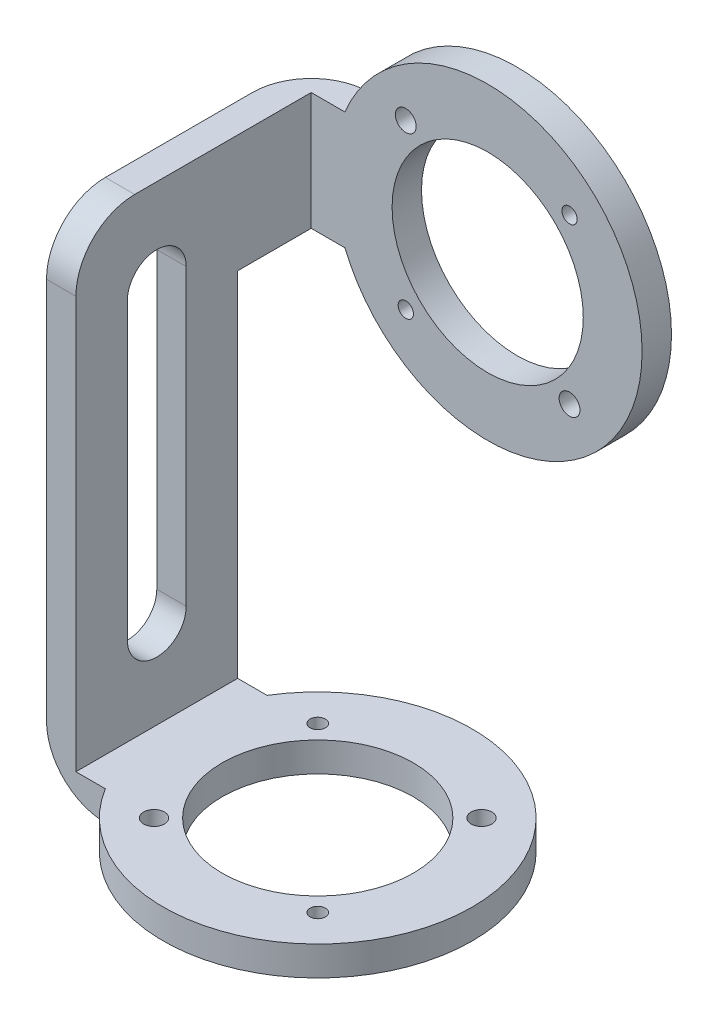
ISO-10303-21;
HEADER;
FILE_DESCRIPTION(('STEP AP214'),'2;1');
FILE_NAME('part.step','',(''),(''),'','','');
FILE_SCHEMA(('AUTOMOTIVE_DESIGN { 1 0 10303 214 1 1 1 1 }'));
ENDSEC;
DATA;
#1=APPLICATION_CONTEXT('core data for automotive mechanical design processes');
#2=APPLICATION_PROTOCOL_DEFINITION('international standard','automotive_design',2000,#1);
#3=PRODUCT_CONTEXT('',#1,'mechanical');
#4=PRODUCT('Part','Part','',(#3));
#5=PRODUCT_RELATED_PRODUCT_CATEGORY('part','',(#4));
#6=PRODUCT_DEFINITION_FORMATION('','',#4);
#7=PRODUCT_DEFINITION_CONTEXT('part definition',#1,'design');
#8=PRODUCT_DEFINITION('design','',#6,#7);
#9=PRODUCT_DEFINITION_SHAPE('','',#8);
#10=(LENGTH_UNIT() NAMED_UNIT(*) SI_UNIT(.MILLI.,.METRE.));
#11=(NAMED_UNIT(*) PLANE_ANGLE_UNIT() SI_UNIT($,.RADIAN.));
#12=(NAMED_UNIT(*) SI_UNIT($,.STERADIAN.) SOLID_ANGLE_UNIT());
#13=UNCERTAINTY_MEASURE_WITH_UNIT(LENGTH_MEASURE(1.E-05),#10,'distance_accuracy_value','');
#14=(GEOMETRIC_REPRESENTATION_CONTEXT(3) GLOBAL_UNCERTAINTY_ASSIGNED_CONTEXT((#13)) GLOBAL_UNIT_ASSIGNED_CONTEXT((#10,
#11,#12)) REPRESENTATION_CONTEXT('',''));
#15=CARTESIAN_POINT('',(0.,0.,0.));
#16=DIRECTION('',(0.,0.,1.));
#17=DIRECTION('',(1.,0.,0.));
#18=AXIS2_PLACEMENT_3D('',#15,#16,#17);
#19=CARTESIAN_POINT('',(0.,0.,6.35));
#20=DIRECTION('',(0.,0.,-1.));
#21=DIRECTION('',(-1.,0.,0.));
#22=AXIS2_PLACEMENT_3D('',#19,#20,#21);
#23=CYLINDRICAL_SURFACE('',#22,33.3375);
#24=CARTESIAN_POINT('',(0.,0.,0.));
#25=DIRECTION('',(0.,0.,1.));
#26=DIRECTION('',(1.,0.,0.));
#27=AXIS2_PLACEMENT_3D('',#24,#25,#26);
#28=CIRCLE('',#27,33.3375);
#29=CARTESIAN_POINT('',(-30.8236744443293,-12.7,0.));
#30=VERTEX_POINT('',#29);
#31=CARTESIAN_POINT('',(-30.8236744443293,12.7,0.));
#32=VERTEX_POINT('',#31);
#33=EDGE_CURVE('E419',#30,#32,#28,.T.);
#34=ORIENTED_EDGE('',*,*,#33,.T.);
#35=DIRECTION('',(0.,0.,-1.));
#36=VECTOR('',#35,1.);
#37=CARTESIAN_POINT('',(-30.8236744443293,12.7,6.35));
#38=LINE('',#37,#36);
#39=CARTESIAN_POINT('',(-30.8236744443293,12.7,6.35));
#40=VERTEX_POINT('',#39);
#41=EDGE_CURVE('E432',#40,#32,#38,.T.);
#42=ORIENTED_EDGE('',*,*,#41,.F.);
#43=CARTESIAN_POINT('',(0.,0.,6.35));
#44=DIRECTION('',(0.,0.,1.));
#45=DIRECTION('',(1.,0.,0.));
#46=AXIS2_PLACEMENT_3D('',#43,#44,#45);
#47=CIRCLE('',#46,33.3375);
#48=CARTESIAN_POINT('',(-30.8236744443293,-12.7,6.35));
#49=VERTEX_POINT('',#48);
#50=EDGE_CURVE('E384',#49,#40,#47,.T.);
#51=ORIENTED_EDGE('',*,*,#50,.F.);
#52=DIRECTION('',(0.,0.,-1.));
#53=VECTOR('',#52,1.);
#54=CARTESIAN_POINT('',(-30.8236744443293,-12.7,6.35));
#55=LINE('',#54,#53);
#56=EDGE_CURVE('E399',#49,#30,#55,.T.);
#57=ORIENTED_EDGE('',*,*,#56,.T.);
#58=EDGE_LOOP('',(#34,#42,#51,#57));
#59=FACE_BOUND('',#58,.T.);
#60=ADVANCED_FACE('F130',(#59),#23,.T.);
#61=CARTESIAN_POINT('',(0.,12.7,6.35));
#62=DIRECTION('',(0.,-1.,0.));
#63=DIRECTION('',(1.,0.,0.));
#64=AXIS2_PLACEMENT_3D('',#61,#62,#63);
#65=PLANE('',#64);
#66=DIRECTION('',(0.,0.,1.));
#67=VECTOR('',#66,1.);
#68=CARTESIAN_POINT('',(-44.45,12.7,0.));
#69=LINE('',#68,#67);
#70=CARTESIAN_POINT('',(-44.45,12.7,12.7));
#71=VERTEX_POINT('',#70);
#72=CARTESIAN_POINT('',(-44.45,12.7,44.45));
#73=VERTEX_POINT('',#72);
#74=EDGE_CURVE('E333',#71,#73,#69,.T.);
#75=ORIENTED_EDGE('',*,*,#74,.T.);
#76=DIRECTION('',(1.,0.,0.));
#77=VECTOR('',#76,1.);
#78=CARTESIAN_POINT('',(-38.1,12.7,44.45));
#79=LINE('',#78,#77);
#80=CARTESIAN_POINT('',(-38.1,12.7,44.45));
#81=VERTEX_POINT('',#80);
#82=EDGE_CURVE('E453',#73,#81,#79,.T.);
#83=ORIENTED_EDGE('',*,*,#82,.T.);
#84=DIRECTION('',(0.,0.,1.));
#85=VECTOR('',#84,1.);
#86=CARTESIAN_POINT('',(-38.1,12.7,0.));
#87=LINE('',#86,#85);
#88=CARTESIAN_POINT('',(-38.1,12.7,6.35));
#89=VERTEX_POINT('',#88);
#90=EDGE_CURVE('E347',#89,#81,#87,.T.);
#91=ORIENTED_EDGE('',*,*,#90,.F.);
#92=DIRECTION('',(-1.,0.,0.));
#93=VECTOR('',#92,1.);
#94=CARTESIAN_POINT('',(0.,12.7,6.35));
#95=LINE('',#94,#93);
#96=EDGE_CURVE('E388',#40,#89,#95,.T.);
#97=ORIENTED_EDGE('',*,*,#96,.F.);
#98=ORIENTED_EDGE('',*,*,#41,.T.);
#99=DIRECTION('',(-1.,0.,0.));
#100=VECTOR('',#99,1.);
#101=CARTESIAN_POINT('',(0.,12.7,0.));
#102=LINE('',#101,#100);
#103=CARTESIAN_POINT('',(-31.75,12.7,0.));
#104=VERTEX_POINT('',#103);
#105=EDGE_CURVE('E423',#32,#104,#102,.T.);
#106=ORIENTED_EDGE('',*,*,#105,.T.);
#107=CARTESIAN_POINT('',(-31.75,12.7,12.7));
#108=DIRECTION('',(0.,-1.,0.));
#109=DIRECTION('',(1.,0.,0.));
#110=AXIS2_PLACEMENT_3D('',#107,#108,#109);
#111=CIRCLE('',#110,12.7);
#112=EDGE_CURVE('E440',#104,#71,#111,.F.);
#113=ORIENTED_EDGE('',*,*,#112,.T.);
#114=EDGE_LOOP('',(#75,#83,#91,#97,#98,#106,#113));
#115=FACE_BOUND('',#114,.T.);
#116=ADVANCED_FACE('F462',(#115),#65,.F.);
#117=CARTESIAN_POINT('',(0.,0.,6.35));
#118=DIRECTION('',(0.,0.,-1.));
#119=DIRECTION('',(-1.,0.,0.));
#120=AXIS2_PLACEMENT_3D('',#117,#118,#119);
#121=CYLINDRICAL_SURFACE('',#120,20.6375);
#122=CARTESIAN_POINT('',(0.,0.,6.35));
#123=DIRECTION('',(0.,0.,1.));
#124=DIRECTION('',(1.,0.,0.));
#125=AXIS2_PLACEMENT_3D('',#122,#123,#124);
#126=CIRCLE('',#125,20.6375);
#127=CARTESIAN_POINT('',(20.6375,0.,6.35));
#128=VERTEX_POINT('',#127);
#129=EDGE_CURVE('E380',#128,#128,#126,.T.);
#130=ORIENTED_EDGE('',*,*,#129,.T.);
#131=EDGE_LOOP('',(#130));
#132=FACE_BOUND('',#131,.T.);
#133=CARTESIAN_POINT('',(0.,0.,0.));
#134=DIRECTION('',(0.,0.,1.));
#135=DIRECTION('',(1.,0.,0.));
#136=AXIS2_PLACEMENT_3D('',#133,#134,#135);
#137=CIRCLE('',#136,20.6375);
#138=CARTESIAN_POINT('',(20.6375,0.,0.));
#139=VERTEX_POINT('',#138);
#140=EDGE_CURVE('E415',#139,#139,#137,.T.);
#141=ORIENTED_EDGE('',*,*,#140,.F.);
#142=EDGE_LOOP('',(#141));
#143=FACE_BOUND('',#142,.T.);
#144=ADVANCED_FACE('F549',(#132,#143),#121,.F.);
#145=CARTESIAN_POINT('',(-17.6776695296635,-17.6776695296638,6.35));
#146=DIRECTION('',(0.,0.,-1.));
#147=DIRECTION('',(-1.,0.,0.));
#148=AXIS2_PLACEMENT_3D('',#145,#146,#147);
#149=CYLINDRICAL_SURFACE('',#148,1.64999999999998);
#150=CARTESIAN_POINT('',(-17.6776695296635,-17.6776695296638,6.35));
#151=DIRECTION('',(0.,0.,1.));
#152=DIRECTION('',(1.,0.,0.));
#153=AXIS2_PLACEMENT_3D('',#150,#151,#152);
#154=CIRCLE('',#153,1.64999999999998);
#155=CARTESIAN_POINT('',(-16.0276695296635,-17.6776695296638,6.35));
#156=VERTEX_POINT('',#155);
#157=EDGE_CURVE('E376',#156,#156,#154,.T.);
#158=ORIENTED_EDGE('',*,*,#157,.T.);
#159=EDGE_LOOP('',(#158));
#160=FACE_BOUND('',#159,.T.);
#161=CARTESIAN_POINT('',(-17.6776695296635,-17.6776695296638,0.));
#162=DIRECTION('',(0.,0.,1.));
#163=DIRECTION('',(1.,0.,0.));
#164=AXIS2_PLACEMENT_3D('',#161,#162,#163);
#165=CIRCLE('',#164,1.64999999999998);
#166=CARTESIAN_POINT('',(-16.0276695296635,-17.6776695296638,0.));
#167=VERTEX_POINT('',#166);
#168=EDGE_CURVE('E411',#167,#167,#165,.T.);
#169=ORIENTED_EDGE('',*,*,#168,.F.);
#170=EDGE_LOOP('',(#169));
#171=FACE_BOUND('',#170,.T.);
#172=ADVANCED_FACE('F554',(#160,#171),#149,.F.);
#173=CARTESIAN_POINT('',(17.6776695296637,-17.6776695296638,6.35));
#174=DIRECTION('',(0.,0.,-1.));
#175=DIRECTION('',(-1.,0.,0.));
#176=AXIS2_PLACEMENT_3D('',#173,#174,#175);
#177=CYLINDRICAL_SURFACE('',#176,2.24999999999997);
#178=CARTESIAN_POINT('',(17.6776695296637,-17.6776695296638,6.35));
#179=DIRECTION('',(0.,0.,1.));
#180=DIRECTION('',(1.,0.,0.));
#181=AXIS2_PLACEMENT_3D('',#178,#179,#180);
#182=CIRCLE('',#181,2.24999999999997);
#183=CARTESIAN_POINT('',(19.9276695296636,-17.6776695296638,6.35));
#184=VERTEX_POINT('',#183);
#185=EDGE_CURVE('E372',#184,#184,#182,.T.);
#186=ORIENTED_EDGE('',*,*,#185,.T.);
#187=EDGE_LOOP('',(#186));
#188=FACE_BOUND('',#187,.T.);
#189=CARTESIAN_POINT('',(17.6776695296637,-17.6776695296638,0.));
#190=DIRECTION('',(0.,0.,1.));
#191=DIRECTION('',(1.,0.,0.));
#192=AXIS2_PLACEMENT_3D('',#189,#190,#191);
#193=CIRCLE('',#192,2.24999999999997);
#194=CARTESIAN_POINT('',(19.9276695296636,-17.6776695296638,0.));
#195=VERTEX_POINT('',#194);
#196=EDGE_CURVE('E407',#195,#195,#193,.T.);
#197=ORIENTED_EDGE('',*,*,#196,.F.);
#198=EDGE_LOOP('',(#197));
#199=FACE_BOUND('',#198,.T.);
#200=ADVANCED_FACE('F558',(#188,#199),#177,.F.);
#201=CARTESIAN_POINT('',(17.6776695296637,17.6776695296637,6.35));
#202=DIRECTION('',(0.,0.,-1.));
#203=DIRECTION('',(-1.,0.,0.));
#204=AXIS2_PLACEMENT_3D('',#201,#202,#203);
#205=CYLINDRICAL_SURFACE('',#204,1.65);
#206=CARTESIAN_POINT('',(17.6776695296637,17.6776695296637,6.35));
#207=DIRECTION('',(0.,0.,1.));
#208=DIRECTION('',(1.,0.,0.));
#209=AXIS2_PLACEMENT_3D('',#206,#207,#208);
#210=CIRCLE('',#209,1.65);
#211=CARTESIAN_POINT('',(19.3276695296637,17.6776695296637,6.35));
#212=VERTEX_POINT('',#211);
#213=EDGE_CURVE('E367',#212,#212,#210,.T.);
#214=ORIENTED_EDGE('',*,*,#213,.T.);
#215=EDGE_LOOP('',(#214));
#216=FACE_BOUND('',#215,.T.);
#217=CARTESIAN_POINT('',(17.6776695296637,17.6776695296637,0.));
#218=DIRECTION('',(0.,0.,1.));
#219=DIRECTION('',(1.,0.,0.));
#220=AXIS2_PLACEMENT_3D('',#217,#218,#219);
#221=CIRCLE('',#220,1.65);
#222=CARTESIAN_POINT('',(19.3276695296637,17.6776695296637,0.));
#223=VERTEX_POINT('',#222);
#224=EDGE_CURVE('E403',#223,#223,#221,.T.);
#225=ORIENTED_EDGE('',*,*,#224,.F.);
#226=EDGE_LOOP('',(#225));
#227=FACE_BOUND('',#226,.T.);
#228=ADVANCED_FACE('F562',(#216,#227),#205,.F.);
#229=CARTESIAN_POINT('',(-17.6776695296635,17.6776695296637,6.35));
#230=DIRECTION('',(0.,0.,-1.));
#231=DIRECTION('',(-1.,0.,0.));
#232=AXIS2_PLACEMENT_3D('',#229,#230,#231);
#233=CYLINDRICAL_SURFACE('',#232,2.25);
#234=CARTESIAN_POINT('',(-17.6776695296635,17.6776695296637,6.35));
#235=DIRECTION('',(0.,0.,1.));
#236=DIRECTION('',(1.,0.,0.));
#237=AXIS2_PLACEMENT_3D('',#234,#235,#236);
#238=CIRCLE('',#237,2.25);
#239=CARTESIAN_POINT('',(-15.4276695296635,17.6776695296637,6.35));
#240=VERTEX_POINT('',#239);
#241=EDGE_CURVE('E363',#240,#240,#238,.T.);
#242=ORIENTED_EDGE('',*,*,#241,.T.);
#243=EDGE_LOOP('',(#242));
#244=FACE_BOUND('',#243,.T.);
#245=CARTESIAN_POINT('',(-17.6776695296635,17.6776695296637,0.));
#246=DIRECTION('',(0.,0.,1.));
#247=DIRECTION('',(1.,0.,0.));
#248=AXIS2_PLACEMENT_3D('',#245,#246,#247);
#249=CIRCLE('',#248,2.25);
#250=CARTESIAN_POINT('',(-15.4276695296635,17.6776695296637,0.));
#251=VERTEX_POINT('',#250);
#252=EDGE_CURVE('E362',#251,#251,#249,.T.);
#253=ORIENTED_EDGE('',*,*,#252,.F.);
#254=EDGE_LOOP('',(#253));
#255=FACE_BOUND('',#254,.T.);
#256=ADVANCED_FACE('F566',(#244,#255),#233,.F.);
#257=CARTESIAN_POINT('',(0.,-12.7,6.35));
#258=DIRECTION('',(0.,1.,0.));
#259=DIRECTION('',(-1.,0.,0.));
#260=AXIS2_PLACEMENT_3D('',#257,#258,#259);
#261=PLANE('',#260);
#262=DIRECTION('',(0.,0.,-1.));
#263=VECTOR('',#262,1.);
#264=CARTESIAN_POINT('',(-44.45,-12.7,22.225));
#265=LINE('',#264,#263);
#266=CARTESIAN_POINT('',(-44.45,-12.7,22.225));
#267=VERTEX_POINT('',#266);
#268=CARTESIAN_POINT('',(-44.45,-12.7,12.7));
#269=VERTEX_POINT('',#268);
#270=EDGE_CURVE('E329',#267,#269,#265,.T.);
#271=ORIENTED_EDGE('',*,*,#270,.T.);
#272=CARTESIAN_POINT('',(-31.75,-12.7,12.7));
#273=DIRECTION('',(0.,1.,0.));
#274=DIRECTION('',(-1.,0.,0.));
#275=AXIS2_PLACEMENT_3D('',#272,#273,#274);
#276=CIRCLE('',#275,12.7);
#277=CARTESIAN_POINT('',(-31.75,-12.7,0.));
#278=VERTEX_POINT('',#277);
#279=EDGE_CURVE('E262',#269,#278,#276,.F.);
#280=ORIENTED_EDGE('',*,*,#279,.T.);
#281=DIRECTION('',(1.,0.,0.));
#282=VECTOR('',#281,1.);
#283=CARTESIAN_POINT('',(0.,-12.7,0.));
#284=LINE('',#283,#282);
#285=EDGE_CURVE('E368',#278,#30,#284,.T.);
#286=ORIENTED_EDGE('',*,*,#285,.T.);
#287=ORIENTED_EDGE('',*,*,#56,.F.);
#288=DIRECTION('',(1.,0.,0.));
#289=VECTOR('',#288,1.);
#290=CARTESIAN_POINT('',(0.,-12.7,6.35));
#291=LINE('',#290,#289);
#292=CARTESIAN_POINT('',(-38.1,-12.7,6.35));
#293=VERTEX_POINT('',#292);
#294=EDGE_CURVE('E396',#293,#49,#291,.T.);
#295=ORIENTED_EDGE('',*,*,#294,.F.);
#296=DIRECTION('',(0.,0.,-1.));
#297=VECTOR('',#296,1.);
#298=CARTESIAN_POINT('',(-38.1,-12.7,22.225));
#299=LINE('',#298,#297);
#300=CARTESIAN_POINT('',(-38.1,-12.7,22.225));
#301=VERTEX_POINT('',#300);
#302=EDGE_CURVE('E328',#301,#293,#299,.T.);
#303=ORIENTED_EDGE('',*,*,#302,.F.);
#304=DIRECTION('',(1.,0.,0.));
#305=VECTOR('',#304,1.);
#306=CARTESIAN_POINT('',(-44.45,-12.7,22.225));
#307=LINE('',#306,#305);
#308=EDGE_CURVE('E344',#267,#301,#307,.T.);
#309=ORIENTED_EDGE('',*,*,#308,.F.);
#310=EDGE_LOOP('',(#271,#280,#286,#287,#295,#303,#309));
#311=FACE_BOUND('',#310,.T.);
#312=ADVANCED_FACE('F473',(#311),#261,.F.);
#313=CARTESIAN_POINT('',(0.,0.,6.35));
#314=DIRECTION('',(0.,0.,1.));
#315=DIRECTION('',(1.,0.,0.));
#316=AXIS2_PLACEMENT_3D('',#313,#314,#315);
#317=PLANE('',#316);
#318=ORIENTED_EDGE('',*,*,#241,.F.);
#319=EDGE_LOOP('',(#318));
#320=FACE_BOUND('',#319,.T.);
#321=ORIENTED_EDGE('',*,*,#213,.F.);
#322=EDGE_LOOP('',(#321));
#323=FACE_BOUND('',#322,.T.);
#324=ORIENTED_EDGE('',*,*,#185,.F.);
#325=EDGE_LOOP('',(#324));
#326=FACE_BOUND('',#325,.T.);
#327=ORIENTED_EDGE('',*,*,#157,.F.);
#328=EDGE_LOOP('',(#327));
#329=FACE_BOUND('',#328,.T.);
#330=ORIENTED_EDGE('',*,*,#129,.F.);
#331=EDGE_LOOP('',(#330));
#332=FACE_BOUND('',#331,.T.);
#333=ORIENTED_EDGE('',*,*,#50,.T.);
#334=ORIENTED_EDGE('',*,*,#96,.T.);
#335=DIRECTION('',(0.,-1.,0.));
#336=VECTOR('',#335,1.);
#337=CARTESIAN_POINT('',(-38.1,0.,6.35));
#338=LINE('',#337,#336);
#339=EDGE_CURVE('E392',#89,#293,#338,.T.);
#340=ORIENTED_EDGE('',*,*,#339,.T.);
#341=ORIENTED_EDGE('',*,*,#294,.T.);
#342=EDGE_LOOP('',(#333,#334,#340,#341));
#343=FACE_BOUND('',#342,.T.);
#344=ADVANCED_FACE('F470',(#320,#323,#326,#329,#332,#343),#317,.T.);
#345=CARTESIAN_POINT('',(0.,0.,0.));
#346=DIRECTION('',(0.,0.,1.));
#347=DIRECTION('',(1.,0.,0.));
#348=AXIS2_PLACEMENT_3D('',#345,#346,#347);
#349=PLANE('',#348);
#350=ORIENTED_EDGE('',*,*,#252,.T.);
#351=EDGE_LOOP('',(#350));
#352=FACE_BOUND('',#351,.T.);
#353=ORIENTED_EDGE('',*,*,#224,.T.);
#354=EDGE_LOOP('',(#353));
#355=FACE_BOUND('',#354,.T.);
#356=ORIENTED_EDGE('',*,*,#196,.T.);
#357=EDGE_LOOP('',(#356));
#358=FACE_BOUND('',#357,.T.);
#359=ORIENTED_EDGE('',*,*,#168,.T.);
#360=EDGE_LOOP('',(#359));
#361=FACE_BOUND('',#360,.T.);
#362=ORIENTED_EDGE('',*,*,#140,.T.);
#363=EDGE_LOOP('',(#362));
#364=FACE_BOUND('',#363,.T.);
#365=ORIENTED_EDGE('',*,*,#285,.F.);
#366=DIRECTION('',(0.,1.,0.));
#367=VECTOR('',#366,1.);
#368=CARTESIAN_POINT('',(-31.75,0.,0.));
#369=LINE('',#368,#367);
#370=EDGE_CURVE('E436',#278,#104,#369,.T.);
#371=ORIENTED_EDGE('',*,*,#370,.T.);
#372=ORIENTED_EDGE('',*,*,#105,.F.);
#373=ORIENTED_EDGE('',*,*,#33,.F.);
#374=EDGE_LOOP('',(#365,#371,#372,#373));
#375=FACE_BOUND('',#374,.T.);
#376=ADVANCED_FACE('F481',(#352,#355,#358,#361,#364,#375),#349,.F.);
#377=CARTESIAN_POINT('',(-38.1,0.,0.));
#378=DIRECTION('',(1.,0.,0.));
#379=DIRECTION('',(0.,0.,-1.));
#380=AXIS2_PLACEMENT_3D('',#377,#378,#379);
#381=PLANE('',#380);
#382=CARTESIAN_POINT('',(-38.1,-6.35,39.6875));
#383=DIRECTION('',(-1.,0.,0.));
#384=DIRECTION('',(0.,0.,1.));
#385=AXIS2_PLACEMENT_3D('',#382,#383,#384);
#386=CIRCLE('',#385,6.35);
#387=CARTESIAN_POINT('',(-38.1,-6.35,46.0375));
#388=VERTEX_POINT('',#387);
#389=CARTESIAN_POINT('',(-38.1,-6.35,33.3375));
#390=VERTEX_POINT('',#389);
#391=EDGE_CURVE('E294',#388,#390,#386,.T.);
#392=ORIENTED_EDGE('',*,*,#391,.T.);
#393=DIRECTION('',(0.,-1.,0.));
#394=VECTOR('',#393,1.);
#395=CARTESIAN_POINT('',(-38.1,0.,33.3375));
#396=LINE('',#395,#394);
#397=CARTESIAN_POINT('',(-38.1,-69.85,33.3375));
#398=VERTEX_POINT('',#397);
#399=EDGE_CURVE('E279',#390,#398,#396,.T.);
#400=ORIENTED_EDGE('',*,*,#399,.T.);
#401=CARTESIAN_POINT('',(-38.1,-69.85,39.6875));
#402=DIRECTION('',(-1.,0.,0.));
#403=DIRECTION('',(0.,0.,1.));
#404=AXIS2_PLACEMENT_3D('',#401,#402,#403);
#405=CIRCLE('',#404,6.35);
#406=CARTESIAN_POINT('',(-38.1,-69.85,46.0375));
#407=VERTEX_POINT('',#406);
#408=EDGE_CURVE('E284',#398,#407,#405,.T.);
#409=ORIENTED_EDGE('',*,*,#408,.T.);
#410=DIRECTION('',(0.,-1.,0.));
#411=VECTOR('',#410,1.);
#412=CARTESIAN_POINT('',(-38.1,0.,46.0375));
#413=LINE('',#412,#411);
#414=EDGE_CURVE('E308',#388,#407,#413,.T.);
#415=ORIENTED_EDGE('',*,*,#414,.F.);
#416=EDGE_LOOP('',(#392,#400,#409,#415));
#417=FACE_BOUND('',#416,.T.);
#418=ORIENTED_EDGE('',*,*,#90,.T.);
#419=CARTESIAN_POINT('',(-38.1,0.,44.45));
#420=DIRECTION('',(1.,0.,0.));
#421=DIRECTION('',(0.,0.,-1.));
#422=AXIS2_PLACEMENT_3D('',#419,#420,#421);
#423=CIRCLE('',#422,12.7);
#424=CARTESIAN_POINT('',(-38.1,0.,57.15));
#425=VERTEX_POINT('',#424);
#426=EDGE_CURVE('E153',#81,#425,#423,.T.);
#427=ORIENTED_EDGE('',*,*,#426,.T.);
#428=DIRECTION('',(0.,-1.,0.));
#429=VECTOR('',#428,1.);
#430=CARTESIAN_POINT('',(-38.1,12.7,57.15));
#431=LINE('',#430,#429);
#432=CARTESIAN_POINT('',(-38.1,-88.9,57.15));
#433=VERTEX_POINT('',#432);
#434=EDGE_CURVE('E350',#425,#433,#431,.T.);
#435=ORIENTED_EDGE('',*,*,#434,.T.);
#436=DIRECTION('',(0.,0.,-1.));
#437=VECTOR('',#436,1.);
#438=CARTESIAN_POINT('',(-38.1,-88.9,57.15));
#439=LINE('',#438,#437);
#440=CARTESIAN_POINT('',(-38.1,-88.9,22.225));
#441=VERTEX_POINT('',#440);
#442=EDGE_CURVE('E353',#433,#441,#439,.T.);
#443=ORIENTED_EDGE('',*,*,#442,.T.);
#444=DIRECTION('',(0.,1.,0.));
#445=VECTOR('',#444,1.);
#446=CARTESIAN_POINT('',(-38.1,-88.9,22.225));
#447=LINE('',#446,#445);
#448=EDGE_CURVE('E334',#441,#301,#447,.T.);
#449=ORIENTED_EDGE('',*,*,#448,.T.);
#450=ORIENTED_EDGE('',*,*,#302,.T.);
#451=ORIENTED_EDGE('',*,*,#339,.F.);
#452=EDGE_LOOP('',(#418,#427,#435,#443,#449,#450,#451));
#453=FACE_BOUND('',#452,.T.);
#454=ADVANCED_FACE('F466',(#417,#453),#381,.T.);
#455=CARTESIAN_POINT('',(-44.45,0.,0.));
#456=DIRECTION('',(1.,0.,0.));
#457=DIRECTION('',(0.,0.,-1.));
#458=AXIS2_PLACEMENT_3D('',#455,#456,#457);
#459=PLANE('',#458);
#460=DIRECTION('',(0.,-1.,0.));
#461=VECTOR('',#460,1.);
#462=CARTESIAN_POINT('',(-44.45,12.7,57.15));
#463=LINE('',#462,#461);
#464=CARTESIAN_POINT('',(-44.45,0.,57.15));
#465=VERTEX_POINT('',#464);
#466=CARTESIAN_POINT('',(-44.45,-82.55,57.15));
#467=VERTEX_POINT('',#466);
#468=EDGE_CURVE('E338',#465,#467,#463,.T.);
#469=ORIENTED_EDGE('',*,*,#468,.F.);
#470=CARTESIAN_POINT('',(-44.45,0.,44.45));
#471=DIRECTION('',(1.,0.,0.));
#472=DIRECTION('',(0.,0.,-1.));
#473=AXIS2_PLACEMENT_3D('',#470,#471,#472);
#474=CIRCLE('',#473,12.7);
#475=EDGE_CURVE('E12',#465,#73,#474,.F.);
#476=ORIENTED_EDGE('',*,*,#475,.T.);
#477=ORIENTED_EDGE('',*,*,#74,.F.);
#478=DIRECTION('',(0.,1.,0.));
#479=VECTOR('',#478,1.);
#480=CARTESIAN_POINT('',(-44.45,0.,12.7));
#481=LINE('',#480,#479);
#482=EDGE_CURVE('E443',#71,#269,#481,.F.);
#483=ORIENTED_EDGE('',*,*,#482,.T.);
#484=ORIENTED_EDGE('',*,*,#270,.F.);
#485=DIRECTION('',(0.,1.,0.));
#486=VECTOR('',#485,1.);
#487=CARTESIAN_POINT('',(-44.45,-88.9,22.225));
#488=LINE('',#487,#486);
#489=CARTESIAN_POINT('',(-44.45,-82.55,22.225));
#490=VERTEX_POINT('',#489);
#491=EDGE_CURVE('E341',#490,#267,#488,.T.);
#492=ORIENTED_EDGE('',*,*,#491,.F.);
#493=DIRECTION('',(0.,0.,-1.));
#494=VECTOR('',#493,1.);
#495=CARTESIAN_POINT('',(-44.45,-82.55,57.15));
#496=LINE('',#495,#494);
#497=EDGE_CURVE('E248',#490,#467,#496,.F.);
#498=ORIENTED_EDGE('',*,*,#497,.T.);
#499=EDGE_LOOP('',(#469,#476,#477,#483,#484,#492,#498));
#500=FACE_BOUND('',#499,.T.);
#501=DIRECTION('',(0.,-1.,0.));
#502=VECTOR('',#501,1.);
#503=CARTESIAN_POINT('',(-44.45,0.,33.3375));
#504=LINE('',#503,#502);
#505=CARTESIAN_POINT('',(-44.45,-6.35,33.3375));
#506=VERTEX_POINT('',#505);
#507=CARTESIAN_POINT('',(-44.45,-69.85,33.3375));
#508=VERTEX_POINT('',#507);
#509=EDGE_CURVE('E290',#506,#508,#504,.T.);
#510=ORIENTED_EDGE('',*,*,#509,.F.);
#511=CARTESIAN_POINT('',(-44.45,-6.35,39.6875));
#512=DIRECTION('',(-1.,0.,0.));
#513=DIRECTION('',(0.,0.,1.));
#514=AXIS2_PLACEMENT_3D('',#511,#512,#513);
#515=CIRCLE('',#514,6.35);
#516=CARTESIAN_POINT('',(-44.45,-6.35,46.0375));
#517=VERTEX_POINT('',#516);
#518=EDGE_CURVE('E301',#517,#506,#515,.T.);
#519=ORIENTED_EDGE('',*,*,#518,.F.);
#520=DIRECTION('',(0.,-1.,0.));
#521=VECTOR('',#520,1.);
#522=CARTESIAN_POINT('',(-44.45,0.,46.0375));
#523=LINE('',#522,#521);
#524=CARTESIAN_POINT('',(-44.45,-69.85,46.0375));
#525=VERTEX_POINT('',#524);
#526=EDGE_CURVE('E297',#517,#525,#523,.T.);
#527=ORIENTED_EDGE('',*,*,#526,.T.);
#528=CARTESIAN_POINT('',(-44.45,-69.85,39.6875));
#529=DIRECTION('',(-1.,0.,0.));
#530=DIRECTION('',(0.,0.,1.));
#531=AXIS2_PLACEMENT_3D('',#528,#529,#530);
#532=CIRCLE('',#531,6.35);
#533=EDGE_CURVE('E293',#508,#525,#532,.T.);
#534=ORIENTED_EDGE('',*,*,#533,.F.);
#535=EDGE_LOOP('',(#510,#519,#527,#534));
#536=FACE_BOUND('',#535,.T.);
#537=ADVANCED_FACE('F489',(#500,#536),#459,.F.);
#538=CARTESIAN_POINT('',(-44.45,-88.9,22.225));
#539=DIRECTION('',(0.,0.,-1.));
#540=DIRECTION('',(-1.,0.,0.));
#541=AXIS2_PLACEMENT_3D('',#538,#539,#540);
#542=PLANE('',#541);
#543=DIRECTION('',(0.,1.,0.));
#544=VECTOR('',#543,1.);
#545=CARTESIAN_POINT('',(-31.75,-95.25,22.225));
#546=LINE('',#545,#544);
#547=CARTESIAN_POINT('',(-31.75,-95.25,22.225));
#548=VERTEX_POINT('',#547);
#549=CARTESIAN_POINT('',(-31.75,-88.9,22.225));
#550=VERTEX_POINT('',#549);
#551=EDGE_CURVE('E267',#548,#550,#546,.T.);
#552=ORIENTED_EDGE('',*,*,#551,.F.);
#553=CARTESIAN_POINT('',(-31.75,-82.55,22.225));
#554=DIRECTION('',(0.,0.,-1.));
#555=DIRECTION('',(-1.,0.,0.));
#556=AXIS2_PLACEMENT_3D('',#553,#554,#555);
#557=CIRCLE('',#556,12.7);
#558=EDGE_CURVE('E242',#548,#490,#557,.T.);
#559=ORIENTED_EDGE('',*,*,#558,.T.);
#560=ORIENTED_EDGE('',*,*,#491,.T.);
#561=ORIENTED_EDGE('',*,*,#308,.T.);
#562=ORIENTED_EDGE('',*,*,#448,.F.);
#563=DIRECTION('',(1.,0.,0.));
#564=VECTOR('',#563,1.);
#565=CARTESIAN_POINT('',(0.,-88.9,22.225));
#566=LINE('',#565,#564);
#567=EDGE_CURVE('E276',#441,#550,#566,.T.);
#568=ORIENTED_EDGE('',*,*,#567,.T.);
#569=EDGE_LOOP('',(#552,#559,#560,#561,#562,#568));
#570=FACE_BOUND('',#569,.T.);
#571=ADVANCED_FACE('F274',(#570),#542,.T.);
#572=CARTESIAN_POINT('',(-44.45,12.7,57.15));
#573=DIRECTION('',(0.,0.,1.));
#574=DIRECTION('',(0.,-1.,0.));
#575=AXIS2_PLACEMENT_3D('',#572,#573,#574);
#576=PLANE('',#575);
#577=ORIENTED_EDGE('',*,*,#434,.F.);
#578=DIRECTION('',(1.,0.,0.));
#579=VECTOR('',#578,1.);
#580=CARTESIAN_POINT('',(-44.45,0.,57.15));
#581=LINE('',#580,#579);
#582=EDGE_CURVE('E139',#425,#465,#581,.F.);
#583=ORIENTED_EDGE('',*,*,#582,.T.);
#584=ORIENTED_EDGE('',*,*,#468,.T.);
#585=CARTESIAN_POINT('',(-31.75,-82.55,57.15));
#586=DIRECTION('',(0.,0.,1.));
#587=DIRECTION('',(0.,-1.,0.));
#588=AXIS2_PLACEMENT_3D('',#585,#586,#587);
#589=CIRCLE('',#588,12.7);
#590=CARTESIAN_POINT('',(-31.75,-95.25,57.15));
#591=VERTEX_POINT('',#590);
#592=EDGE_CURVE('E450',#467,#591,#589,.T.);
#593=ORIENTED_EDGE('',*,*,#592,.T.);
#594=DIRECTION('',(0.,1.,0.));
#595=VECTOR('',#594,1.);
#596=CARTESIAN_POINT('',(-31.75,-95.25,57.15));
#597=LINE('',#596,#595);
#598=CARTESIAN_POINT('',(-31.75,-88.9,57.15));
#599=VERTEX_POINT('',#598);
#600=EDGE_CURVE('E269',#591,#599,#597,.T.);
#601=ORIENTED_EDGE('',*,*,#600,.T.);
#602=DIRECTION('',(-1.,0.,0.));
#603=VECTOR('',#602,1.);
#604=CARTESIAN_POINT('',(0.,-88.9,57.15));
#605=LINE('',#604,#603);
#606=EDGE_CURVE('E494',#599,#433,#605,.T.);
#607=ORIENTED_EDGE('',*,*,#606,.T.);
#608=EDGE_LOOP('',(#577,#583,#584,#593,#601,#607));
#609=FACE_BOUND('',#608,.T.);
#610=ADVANCED_FACE('F491',(#609),#576,.T.);
#611=CARTESIAN_POINT('',(-44.45,0.,33.3375));
#612=DIRECTION('',(0.,0.,1.));
#613=DIRECTION('',(0.,-1.,0.));
#614=AXIS2_PLACEMENT_3D('',#611,#612,#613);
#615=PLANE('',#614);
#616=ORIENTED_EDGE('',*,*,#399,.F.);
#617=DIRECTION('',(1.,0.,0.));
#618=VECTOR('',#617,1.);
#619=CARTESIAN_POINT('',(-44.45,-6.35,33.3375));
#620=LINE('',#619,#618);
#621=EDGE_CURVE('E303',#506,#390,#620,.T.);
#622=ORIENTED_EDGE('',*,*,#621,.F.);
#623=ORIENTED_EDGE('',*,*,#509,.T.);
#624=DIRECTION('',(1.,0.,0.));
#625=VECTOR('',#624,1.);
#626=CARTESIAN_POINT('',(-44.45,-69.85,33.3375));
#627=LINE('',#626,#625);
#628=EDGE_CURVE('E324',#508,#398,#627,.T.);
#629=ORIENTED_EDGE('',*,*,#628,.T.);
#630=EDGE_LOOP('',(#616,#622,#623,#629));
#631=FACE_BOUND('',#630,.T.);
#632=ADVANCED_FACE('F585',(#631),#615,.T.);
#633=CARTESIAN_POINT('',(-44.45,-69.85,39.6875));
#634=DIRECTION('',(1.,0.,0.));
#635=DIRECTION('',(0.,0.,-1.));
#636=AXIS2_PLACEMENT_3D('',#633,#634,#635);
#637=CYLINDRICAL_SURFACE('',#636,6.35);
#638=ORIENTED_EDGE('',*,*,#408,.F.);
#639=ORIENTED_EDGE('',*,*,#628,.F.);
#640=ORIENTED_EDGE('',*,*,#533,.T.);
#641=DIRECTION('',(1.,0.,0.));
#642=VECTOR('',#641,1.);
#643=CARTESIAN_POINT('',(-44.45,-69.85,46.0375));
#644=LINE('',#643,#642);
#645=EDGE_CURVE('E321',#525,#407,#644,.T.);
#646=ORIENTED_EDGE('',*,*,#645,.T.);
#647=EDGE_LOOP('',(#638,#639,#640,#646));
#648=FACE_BOUND('',#647,.T.);
#649=ADVANCED_FACE('F731',(#648),#637,.F.);
#650=CARTESIAN_POINT('',(-44.45,0.,46.0375));
#651=DIRECTION('',(0.,0.,1.));
#652=DIRECTION('',(0.,-1.,0.));
#653=AXIS2_PLACEMENT_3D('',#650,#651,#652);
#654=PLANE('',#653);
#655=ORIENTED_EDGE('',*,*,#414,.T.);
#656=ORIENTED_EDGE('',*,*,#645,.F.);
#657=ORIENTED_EDGE('',*,*,#526,.F.);
#658=DIRECTION('',(1.,0.,0.));
#659=VECTOR('',#658,1.);
#660=CARTESIAN_POINT('',(-44.45,-6.35,46.0375));
#661=LINE('',#660,#659);
#662=EDGE_CURVE('E318',#517,#388,#661,.T.);
#663=ORIENTED_EDGE('',*,*,#662,.T.);
#664=EDGE_LOOP('',(#655,#656,#657,#663));
#665=FACE_BOUND('',#664,.T.);
#666=ADVANCED_FACE('F722',(#665),#654,.F.);
#667=CARTESIAN_POINT('',(-44.45,-6.35,39.6875));
#668=DIRECTION('',(1.,0.,0.));
#669=DIRECTION('',(0.,0.,-1.));
#670=AXIS2_PLACEMENT_3D('',#667,#668,#669);
#671=CYLINDRICAL_SURFACE('',#670,6.35);
#672=ORIENTED_EDGE('',*,*,#391,.F.);
#673=ORIENTED_EDGE('',*,*,#662,.F.);
#674=ORIENTED_EDGE('',*,*,#518,.T.);
#675=ORIENTED_EDGE('',*,*,#621,.T.);
#676=EDGE_LOOP('',(#672,#673,#674,#675));
#677=FACE_BOUND('',#676,.T.);
#678=ADVANCED_FACE('F654',(#677),#671,.F.);
#679=CARTESIAN_POINT('',(-3.35193668575268,-95.25,39.6875));
#680=DIRECTION('',(0.,1.,0.));
#681=DIRECTION('',(0.,0.,1.));
#682=AXIS2_PLACEMENT_3D('',#679,#680,#681);
#683=CYLINDRICAL_SURFACE('',#682,33.3375);
#684=CARTESIAN_POINT('',(-3.35193668575268,-88.9,39.6875));
#685=DIRECTION('',(0.,-1.,0.));
#686=DIRECTION('',(0.,0.,-1.));
#687=AXIS2_PLACEMENT_3D('',#684,#685,#686);
#688=CIRCLE('',#687,33.3375);
#689=EDGE_CURVE('E499',#550,#599,#688,.T.);
#690=ORIENTED_EDGE('',*,*,#689,.T.);
#691=ORIENTED_EDGE('',*,*,#600,.F.);
#692=CARTESIAN_POINT('',(-3.35193668575268,-95.25,39.6875));
#693=DIRECTION('',(0.,-1.,0.));
#694=DIRECTION('',(0.,0.,-1.));
#695=AXIS2_PLACEMENT_3D('',#692,#693,#694);
#696=CIRCLE('',#695,33.3375);
#697=EDGE_CURVE('E259',#548,#591,#696,.T.);
#698=ORIENTED_EDGE('',*,*,#697,.F.);
#699=ORIENTED_EDGE('',*,*,#551,.T.);
#700=EDGE_LOOP('',(#690,#691,#698,#699));
#701=FACE_BOUND('',#700,.T.);
#702=ADVANCED_FACE('F266',(#701),#683,.T.);
#703=CARTESIAN_POINT('',(-21.0296062154146,-95.25,22.0098304703361));
#704=DIRECTION('',(0.,1.,0.));
#705=DIRECTION('',(0.,0.,1.));
#706=AXIS2_PLACEMENT_3D('',#703,#704,#705);
#707=CYLINDRICAL_SURFACE('',#706,1.64999999999943);
#708=CARTESIAN_POINT('',(-21.0296062154146,-95.25,22.0098304703361));
#709=DIRECTION('',(0.,-1.,0.));
#710=DIRECTION('',(0.,0.,-1.));
#711=AXIS2_PLACEMENT_3D('',#708,#709,#710);
#712=CIRCLE('',#711,1.64999999999943);
#713=CARTESIAN_POINT('',(-21.0296062154146,-95.25,20.3598304703367));
#714=VERTEX_POINT('',#713);
#715=EDGE_CURVE('E859',#714,#714,#712,.T.);
#716=ORIENTED_EDGE('',*,*,#715,.T.);
#717=EDGE_LOOP('',(#716));
#718=FACE_BOUND('',#717,.T.);
#719=CARTESIAN_POINT('',(-21.0296062154146,-88.9,22.0098304703361));
#720=DIRECTION('',(0.,-1.,0.));
#721=DIRECTION('',(0.,0.,-1.));
#722=AXIS2_PLACEMENT_3D('',#719,#720,#721);
#723=CIRCLE('',#722,1.64999999999943);
#724=CARTESIAN_POINT('',(-21.0296062154146,-88.9,20.3598304703367));
#725=VERTEX_POINT('',#724);
#726=EDGE_CURVE('E518',#725,#725,#723,.T.);
#727=ORIENTED_EDGE('',*,*,#726,.F.);
#728=EDGE_LOOP('',(#727));
#729=FACE_BOUND('',#728,.T.);
#730=ADVANCED_FACE('F653',(#718,#729),#707,.F.);
#731=CARTESIAN_POINT('',(14.3257328439109,-95.25,22.0098304703361));
#732=DIRECTION('',(0.,1.,0.));
#733=DIRECTION('',(0.,0.,1.));
#734=AXIS2_PLACEMENT_3D('',#731,#732,#733);
#735=CYLINDRICAL_SURFACE('',#734,2.24999999999997);
#736=CARTESIAN_POINT('',(14.3257328439109,-95.25,22.0098304703361));
#737=DIRECTION('',(0.,-1.,0.));
#738=DIRECTION('',(0.,0.,-1.));
#739=AXIS2_PLACEMENT_3D('',#736,#737,#738);
#740=CIRCLE('',#739,2.24999999999997);
#741=CARTESIAN_POINT('',(14.3257328439109,-95.25,19.7598304703361));
#742=VERTEX_POINT('',#741);
#743=EDGE_CURVE('E864',#742,#742,#740,.T.);
#744=ORIENTED_EDGE('',*,*,#743,.T.);
#745=EDGE_LOOP('',(#744));
#746=FACE_BOUND('',#745,.T.);
#747=CARTESIAN_POINT('',(14.3257328439109,-88.9,22.0098304703361));
#748=DIRECTION('',(0.,-1.,0.));
#749=DIRECTION('',(0.,0.,-1.));
#750=AXIS2_PLACEMENT_3D('',#747,#748,#749);
#751=CIRCLE('',#750,2.24999999999997);
#752=CARTESIAN_POINT('',(14.3257328439109,-88.9,19.7598304703361));
#753=VERTEX_POINT('',#752);
#754=EDGE_CURVE('E514',#753,#753,#751,.T.);
#755=ORIENTED_EDGE('',*,*,#754,.F.);
#756=EDGE_LOOP('',(#755));
#757=FACE_BOUND('',#756,.T.);
#758=ADVANCED_FACE('F696',(#746,#757),#735,.F.);
#759=CARTESIAN_POINT('',(14.3257328439109,-95.25,57.3651695296638));
#760=DIRECTION('',(0.,1.,0.));
#761=DIRECTION('',(0.,0.,1.));
#762=AXIS2_PLACEMENT_3D('',#759,#760,#761);
#763=CYLINDRICAL_SURFACE('',#762,1.64999999999943);
#764=CARTESIAN_POINT('',(14.3257328439109,-95.25,57.3651695296638));
#765=DIRECTION('',(0.,-1.,0.));
#766=DIRECTION('',(0.,0.,-1.));
#767=AXIS2_PLACEMENT_3D('',#764,#765,#766);
#768=CIRCLE('',#767,1.64999999999943);
#769=CARTESIAN_POINT('',(14.3257328439109,-95.25,55.7151695296644));
#770=VERTEX_POINT('',#769);
#771=EDGE_CURVE('E870',#770,#770,#768,.T.);
#772=ORIENTED_EDGE('',*,*,#771,.T.);
#773=EDGE_LOOP('',(#772));
#774=FACE_BOUND('',#773,.T.);
#775=CARTESIAN_POINT('',(14.3257328439109,-88.9,57.3651695296638));
#776=DIRECTION('',(0.,-1.,0.));
#777=DIRECTION('',(0.,0.,-1.));
#778=AXIS2_PLACEMENT_3D('',#775,#776,#777);
#779=CIRCLE('',#778,1.64999999999943);
#780=CARTESIAN_POINT('',(14.3257328439109,-88.9,55.7151695296644));
#781=VERTEX_POINT('',#780);
#782=EDGE_CURVE('E506',#781,#781,#779,.T.);
#783=ORIENTED_EDGE('',*,*,#782,.F.);
#784=EDGE_LOOP('',(#783));
#785=FACE_BOUND('',#784,.T.);
#786=ADVANCED_FACE('F537',(#774,#785),#763,.F.);
#787=CARTESIAN_POINT('',(-21.0296062154146,-95.25,57.3651695296638));
#788=DIRECTION('',(0.,1.,0.));
#789=DIRECTION('',(0.,0.,1.));
#790=AXIS2_PLACEMENT_3D('',#787,#788,#789);
#791=CYLINDRICAL_SURFACE('',#790,2.25);
#792=CARTESIAN_POINT('',(-21.0296062154146,-95.25,57.3651695296638));
#793=DIRECTION('',(0.,-1.,0.));
#794=DIRECTION('',(0.,0.,-1.));
#795=AXIS2_PLACEMENT_3D('',#792,#793,#794);
#796=CIRCLE('',#795,2.25);
#797=CARTESIAN_POINT('',(-21.0296062154146,-95.25,55.1151695296638));
#798=VERTEX_POINT('',#797);
#799=EDGE_CURVE('E271',#798,#798,#796,.T.);
#800=ORIENTED_EDGE('',*,*,#799,.T.);
#801=EDGE_LOOP('',(#800));
#802=FACE_BOUND('',#801,.T.);
#803=CARTESIAN_POINT('',(-21.0296062154146,-88.9,57.3651695296638));
#804=DIRECTION('',(0.,-1.,0.));
#805=DIRECTION('',(0.,0.,-1.));
#806=AXIS2_PLACEMENT_3D('',#803,#804,#805);
#807=CIRCLE('',#806,2.25);
#808=CARTESIAN_POINT('',(-21.0296062154146,-88.9,55.1151695296638));
#809=VERTEX_POINT('',#808);
#810=EDGE_CURVE('E501',#809,#809,#807,.T.);
#811=ORIENTED_EDGE('',*,*,#810,.F.);
#812=EDGE_LOOP('',(#811));
#813=FACE_BOUND('',#812,.T.);
#814=ADVANCED_FACE('F528',(#802,#813),#791,.F.);
#815=CARTESIAN_POINT('',(-3.35193668575268,-95.25,39.6875));
#816=DIRECTION('',(0.,1.,0.));
#817=DIRECTION('',(0.,0.,1.));
#818=AXIS2_PLACEMENT_3D('',#815,#816,#817);
#819=CYLINDRICAL_SURFACE('',#818,20.6375);
#820=CARTESIAN_POINT('',(-3.35193668575268,-95.25,39.6875));
#821=DIRECTION('',(0.,-1.,0.));
#822=DIRECTION('',(0.,0.,-1.));
#823=AXIS2_PLACEMENT_3D('',#820,#821,#822);
#824=CIRCLE('',#823,20.6375);
#825=CARTESIAN_POINT('',(-3.35193668575268,-95.25,19.05));
#826=VERTEX_POINT('',#825);
#827=EDGE_CURVE('E286',#826,#826,#824,.T.);
#828=ORIENTED_EDGE('',*,*,#827,.T.);
#829=EDGE_LOOP('',(#828));
#830=FACE_BOUND('',#829,.T.);
#831=CARTESIAN_POINT('',(-3.35193668575268,-88.9,39.6875));
#832=DIRECTION('',(0.,-1.,0.));
#833=DIRECTION('',(0.,0.,-1.));
#834=AXIS2_PLACEMENT_3D('',#831,#832,#833);
#835=CIRCLE('',#834,20.6375);
#836=CARTESIAN_POINT('',(-3.35193668575268,-88.9,19.05));
#837=VERTEX_POINT('',#836);
#838=EDGE_CURVE('E272',#837,#837,#835,.T.);
#839=ORIENTED_EDGE('',*,*,#838,.F.);
#840=EDGE_LOOP('',(#839));
#841=FACE_BOUND('',#840,.T.);
#842=ADVANCED_FACE('F526',(#830,#841),#819,.F.);
#843=CARTESIAN_POINT('',(0.,-95.25,0.));
#844=DIRECTION('',(0.,-1.,0.));
#845=DIRECTION('',(0.,0.,-1.));
#846=AXIS2_PLACEMENT_3D('',#843,#844,#845);
#847=PLANE('',#846);
#848=ORIENTED_EDGE('',*,*,#697,.T.);
#849=DIRECTION('',(0.,0.,-1.));
#850=VECTOR('',#849,1.);
#851=CARTESIAN_POINT('',(-31.75,-95.25,22.225));
#852=LINE('',#851,#850);
#853=EDGE_CURVE('E246',#591,#548,#852,.T.);
#854=ORIENTED_EDGE('',*,*,#853,.T.);
#855=EDGE_LOOP('',(#848,#854));
#856=FACE_BOUND('',#855,.T.);
#857=ORIENTED_EDGE('',*,*,#799,.F.);
#858=EDGE_LOOP('',(#857));
#859=FACE_BOUND('',#858,.T.);
#860=ORIENTED_EDGE('',*,*,#771,.F.);
#861=EDGE_LOOP('',(#860));
#862=FACE_BOUND('',#861,.T.);
#863=ORIENTED_EDGE('',*,*,#743,.F.);
#864=EDGE_LOOP('',(#863));
#865=FACE_BOUND('',#864,.T.);
#866=ORIENTED_EDGE('',*,*,#715,.F.);
#867=EDGE_LOOP('',(#866));
#868=FACE_BOUND('',#867,.T.);
#869=ORIENTED_EDGE('',*,*,#827,.F.);
#870=EDGE_LOOP('',(#869));
#871=FACE_BOUND('',#870,.T.);
#872=ADVANCED_FACE('F257',(#856,#859,#862,#865,#868,#871),#847,.T.);
#873=CARTESIAN_POINT('',(0.,-88.9,0.));
#874=DIRECTION('',(0.,-1.,0.));
#875=DIRECTION('',(0.,0.,-1.));
#876=AXIS2_PLACEMENT_3D('',#873,#874,#875);
#877=PLANE('',#876);
#878=ORIENTED_EDGE('',*,*,#442,.F.);
#879=ORIENTED_EDGE('',*,*,#606,.F.);
#880=ORIENTED_EDGE('',*,*,#689,.F.);
#881=ORIENTED_EDGE('',*,*,#567,.F.);
#882=EDGE_LOOP('',(#878,#879,#880,#881));
#883=FACE_BOUND('',#882,.T.);
#884=ORIENTED_EDGE('',*,*,#810,.T.);
#885=EDGE_LOOP('',(#884));
#886=FACE_BOUND('',#885,.T.);
#887=ORIENTED_EDGE('',*,*,#782,.T.);
#888=EDGE_LOOP('',(#887));
#889=FACE_BOUND('',#888,.T.);
#890=ORIENTED_EDGE('',*,*,#754,.T.);
#891=EDGE_LOOP('',(#890));
#892=FACE_BOUND('',#891,.T.);
#893=ORIENTED_EDGE('',*,*,#726,.T.);
#894=EDGE_LOOP('',(#893));
#895=FACE_BOUND('',#894,.T.);
#896=ORIENTED_EDGE('',*,*,#838,.T.);
#897=EDGE_LOOP('',(#896));
#898=FACE_BOUND('',#897,.T.);
#899=ADVANCED_FACE('F497',(#883,#886,#889,#892,#895,#898),#877,.F.);
#900=CARTESIAN_POINT('',(-31.75,0.,12.7));
#901=DIRECTION('',(0.,1.,0.));
#902=DIRECTION('',(0.,0.,1.));
#903=AXIS2_PLACEMENT_3D('',#900,#901,#902);
#904=CYLINDRICAL_SURFACE('',#903,12.7);
#905=ORIENTED_EDGE('',*,*,#279,.F.);
#906=ORIENTED_EDGE('',*,*,#482,.F.);
#907=ORIENTED_EDGE('',*,*,#112,.F.);
#908=ORIENTED_EDGE('',*,*,#370,.F.);
#909=EDGE_LOOP('',(#905,#906,#907,#908));
#910=FACE_BOUND('',#909,.T.);
#911=ADVANCED_FACE('F485',(#910),#904,.T.);
#912=CARTESIAN_POINT('',(-31.75,-82.55,0.));
#913=DIRECTION('',(0.,0.,1.));
#914=DIRECTION('',(0.,-1.,0.));
#915=AXIS2_PLACEMENT_3D('',#912,#913,#914);
#916=CYLINDRICAL_SURFACE('',#915,12.7);
#917=ORIENTED_EDGE('',*,*,#592,.F.);
#918=ORIENTED_EDGE('',*,*,#497,.F.);
#919=ORIENTED_EDGE('',*,*,#558,.F.);
#920=ORIENTED_EDGE('',*,*,#853,.F.);
#921=EDGE_LOOP('',(#917,#918,#919,#920));
#922=FACE_BOUND('',#921,.T.);
#923=ADVANCED_FACE('F245',(#922),#916,.T.);
#924=CARTESIAN_POINT('',(0.,0.,44.45));
#925=DIRECTION('',(-1.,0.,0.));
#926=DIRECTION('',(0.,-1.,0.));
#927=AXIS2_PLACEMENT_3D('',#924,#925,#926);
#928=CYLINDRICAL_SURFACE('',#927,12.7);
#929=ORIENTED_EDGE('',*,*,#475,.F.);
#930=ORIENTED_EDGE('',*,*,#582,.F.);
#931=ORIENTED_EDGE('',*,*,#426,.F.);
#932=ORIENTED_EDGE('',*,*,#82,.F.);
#933=EDGE_LOOP('',(#929,#930,#931,#932));
#934=FACE_BOUND('',#933,.T.);
#935=ADVANCED_FACE('F132',(#934),#928,.T.);
#936=CLOSED_SHELL('',(#60,#116,#144,#172,#200,#228,#256,#312,#344,#376,#454,#537,#571,#610,#632,
#649,#666,#678,#702,#730,#758,#786,#814,#842,#872,#899,#911,#923,#935));
#937=MANIFOLD_SOLID_BREP('B2',#936);
#938=ADVANCED_BREP_SHAPE_REPRESENTATION('',(#18,#937),#14);
#939=SHAPE_DEFINITION_REPRESENTATION(#9,#938);
ENDSEC;
END-ISO-10303-21;
